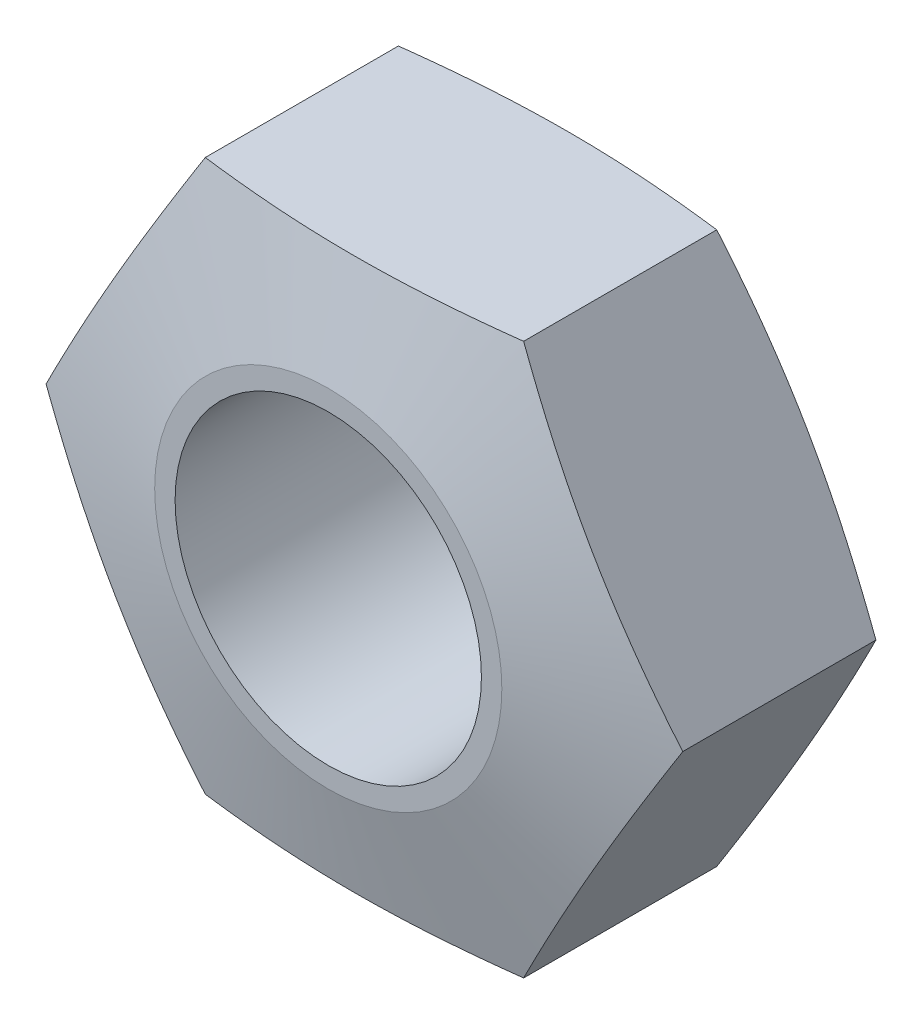
ISO-10303-21;
HEADER;
FILE_DESCRIPTION(('STEP AP214'),'2;1');
FILE_NAME('part.step','',(''),(''),'','','');
FILE_SCHEMA(('AUTOMOTIVE_DESIGN { 1 0 10303 214 1 1 1 1 }'));
ENDSEC;
DATA;
#1=APPLICATION_CONTEXT('core data for automotive mechanical design processes');
#2=APPLICATION_PROTOCOL_DEFINITION('international standard','automotive_design',2000,#1);
#3=PRODUCT_CONTEXT('',#1,'mechanical');
#4=PRODUCT('Part','Part','',(#3));
#5=PRODUCT_RELATED_PRODUCT_CATEGORY('part','',(#4));
#6=PRODUCT_DEFINITION_FORMATION('','',#4);
#7=PRODUCT_DEFINITION_CONTEXT('part definition',#1,'design');
#8=PRODUCT_DEFINITION('design','',#6,#7);
#9=PRODUCT_DEFINITION_SHAPE('','',#8);
#10=(LENGTH_UNIT() NAMED_UNIT(*) SI_UNIT(.MILLI.,.METRE.));
#11=(NAMED_UNIT(*) PLANE_ANGLE_UNIT() SI_UNIT($,.RADIAN.));
#12=(NAMED_UNIT(*) SI_UNIT($,.STERADIAN.) SOLID_ANGLE_UNIT());
#13=UNCERTAINTY_MEASURE_WITH_UNIT(LENGTH_MEASURE(1.E-05),#10,'distance_accuracy_value','');
#14=(GEOMETRIC_REPRESENTATION_CONTEXT(3) GLOBAL_UNCERTAINTY_ASSIGNED_CONTEXT((#13)) GLOBAL_UNIT_ASSIGNED_CONTEXT((#10,
#11,#12)) REPRESENTATION_CONTEXT('',''));
#15=CARTESIAN_POINT('',(0.,0.,0.));
#16=DIRECTION('',(0.,0.,1.));
#17=DIRECTION('',(1.,0.,0.));
#18=AXIS2_PLACEMENT_3D('',#15,#16,#17);
#19=CARTESIAN_POINT('',(-3.11769145362398,0.,2.6));
#20=DIRECTION('',(0.866025403784435,0.500000000000007,0.));
#21=DIRECTION('',(-0.500000000000007,0.866025403784435,0.));
#22=AXIS2_PLACEMENT_3D('',#19,#20,#21);
#23=PLANE('',#22);
#24=DIRECTION('',(0.,0.,1.));
#25=VECTOR('',#24,1.);
#26=CARTESIAN_POINT('',(-1.55884572681197,-2.70000000000002,2.6));
#27=LINE('',#26,#25);
#28=CARTESIAN_POINT('',(-1.55884567831965,-2.70000000000002,0.354422857323158));
#29=VERTEX_POINT('',#28);
#30=CARTESIAN_POINT('',(-1.55884575106109,-2.69999995799929,2.24557714266442));
#31=VERTEX_POINT('',#30);
#32=EDGE_CURVE('E112',#29,#31,#27,.T.);
#33=ORIENTED_EDGE('',*,*,#32,.T.);
#34=CARTESIAN_POINT('',(-3.11769145363667,7.17106538033776E-12,2.24557713660658));
#35=CARTESIAN_POINT('',(-3.05292867419917,-0.112172424408485,2.26177406951914));
#36=CARTESIAN_POINT('',(-2.98806345736563,-0.224522275604257,2.27647355567524));
#37=CARTESIAN_POINT('',(-2.85813356101788,-0.449567457497872,2.30229361562595));
#38=CARTESIAN_POINT('',(-2.79306881954447,-0.56226289551219,2.31341293282755));
#39=CARTESIAN_POINT('',(-2.66308367272997,-0.787403774024961,2.33143583605498));
#40=CARTESIAN_POINT('',(-2.59816393414497,-0.899848059667983,2.33835815564568));
#41=CARTESIAN_POINT('',(-2.46825232603171,-1.12486156541292,2.34763985615969));
#42=CARTESIAN_POINT('',(-2.4032604703706,-1.23743076149622,2.34999999942299));
#43=CARTESIAN_POINT('',(-2.27327675902964,-1.46256915369518,2.3500000006016));
#44=CARTESIAN_POINT('',(-2.20828490334979,-1.57513834981085,2.34763985851636));
#45=CARTESIAN_POINT('',(-2.07837329518059,-1.80015185565285,2.33835816028019));
#46=CARTESIAN_POINT('',(-2.0134535565584,-1.91259614136058,2.33143584178928));
#47=CARTESIAN_POINT('',(-1.88346840965757,-2.13773702002212,2.31341294063358));
#48=CARTESIAN_POINT('',(-1.81840366813497,-2.2504324581206,2.30229362440338));
#49=CARTESIAN_POINT('',(-1.68847377168409,-2.47547764019568,2.27647356624278));
#50=CARTESIAN_POINT('',(-1.62360855479663,-2.58782749148873,2.26177408090534));
#51=CARTESIAN_POINT('',(-1.55884577530877,-2.69999991600109,2.24557714872634));
#52=B_SPLINE_CURVE_WITH_KNOTS('',3,(#34,#35,#36,#37,#38,#39,#40,#41,#42,#43,#44,#45,#46,#47,#48,
#49,#50,#51),.UNSPECIFIED.,.F.,.F.,(4,2,2,2,2,2,2,2,4),(0.,0.391620655021264,0.783378614368188,
1.17337481077486,1.5633058331533,1.95323685557831,2.34323305202915,2.73499101141513,
3.12661166648705),.UNSPECIFIED.);
#53=CARTESIAN_POINT('',(-3.11769145360933,5.10648189547578E-12,2.2455771366119));
#54=VERTEX_POINT('',#53);
#55=EDGE_CURVE('E95',#54,#31,#52,.T.);
#56=ORIENTED_EDGE('',*,*,#55,.F.);
#57=DIRECTION('',(0.,0.,1.));
#58=VECTOR('',#57,1.);
#59=CARTESIAN_POINT('',(-3.11769145362398,0.,2.6));
#60=LINE('',#59,#58);
#61=CARTESIAN_POINT('',(-3.11769145362801,0.,0.354422863381387));
#62=VERTEX_POINT('',#61);
#63=EDGE_CURVE('E42',#54,#62,#60,.F.);
#64=ORIENTED_EDGE('',*,*,#63,.T.);
#65=CARTESIAN_POINT('',(-1.55884570367168,-2.70000004008016,0.354422869169767));
#66=CARTESIAN_POINT('',(-1.6236084860841,-2.58782761050233,0.338225935148355));
#67=CARTESIAN_POINT('',(-1.68847370590511,-2.47547775412822,0.323526447987274));
#68=CARTESIAN_POINT('',(-1.81840360825192,-2.25043256184108,0.297706386316205));
#69=CARTESIAN_POINT('',(-1.88346835273694,-2.13773711861154,0.286587068399497));
#70=CARTESIAN_POINT('',(-2.01345350555274,-1.91259622970499,0.268564164121406));
#71=CARTESIAN_POINT('',(-2.07837324712729,-1.80015193888362,0.261641844191989));
#72=CARTESIAN_POINT('',(-2.20828486122402,-1.57513842277481,0.252360143429213));
#73=CARTESIAN_POINT('',(-2.27327671987903,-1.462569221506,0.25000000025567));
#74=CARTESIAN_POINT('',(-2.40326043719796,-1.23743081895294,0.249999999693409));
#75=CARTESIAN_POINT('',(-2.46825229586189,-1.12486161766869,0.25236014230496));
#76=CARTESIAN_POINT('',(-2.59816390998531,-0.899848101513635,0.261641841981025));
#77=CARTESIAN_POINT('',(-2.66308365157766,-0.787403810661453,0.268564161385716));
#78=CARTESIAN_POINT('',(-2.79306880443445,-0.562262921683897,0.286587064675604));
#79=CARTESIAN_POINT('',(-2.8581335489427,-0.449567478414119,0.297706382129095));
#80=CARTESIAN_POINT('',(-2.9880634513393,-0.224522286040744,0.323526442945617));
#81=CARTESIAN_POINT('',(-3.05292867118686,-0.112172429620652,0.338225929715393));
#82=CARTESIAN_POINT('',(-3.11769145362534,2.33767635153521E-12,0.354422863385037));
#83=B_SPLINE_CURVE_WITH_KNOTS('',3,(#65,#66,#67,#68,#69,#70,#71,#72,#73,#74,#75,#76,#77,#78,#79,
#80,#81,#82),.UNSPECIFIED.,.F.,.F.,(4,2,2,2,2,2,2,2,4),(0.,0.391620673173809,0.783378650698375,
1.1733748650613,1.56330590538311,1.95323694572706,2.34323316011099,2.7349911376541,
3.12661181085199),.UNSPECIFIED.);
#84=EDGE_CURVE('E101',#29,#62,#83,.T.);
#85=ORIENTED_EDGE('',*,*,#84,.F.);
#86=EDGE_LOOP('',(#33,#56,#64,#85));
#87=FACE_BOUND('',#86,.T.);
#88=ADVANCED_FACE('F17',(#87),#23,.F.);
#89=CARTESIAN_POINT('',(-1.55884572681197,-2.70000000000002,2.6));
#90=DIRECTION('',(0.,1.,0.));
#91=DIRECTION('',(-1.,0.,0.));
#92=AXIS2_PLACEMENT_3D('',#89,#90,#91);
#93=PLANE('',#92);
#94=DIRECTION('',(0.,0.,1.));
#95=VECTOR('',#94,1.);
#96=CARTESIAN_POINT('',(1.55884572681202,-2.69999999999998,2.6));
#97=LINE('',#96,#95);
#98=CARTESIAN_POINT('',(1.55884575106576,-2.69999995799128,0.354422857321263));
#99=VERTEX_POINT('',#98);
#100=CARTESIAN_POINT('',(1.55884567829528,-2.69999999999998,2.24557714266673));
#101=VERTEX_POINT('',#100);
#102=EDGE_CURVE('E83',#99,#101,#97,.T.);
#103=ORIENTED_EDGE('',*,*,#102,.T.);
#104=CARTESIAN_POINT('',(-1.55884577310247,-2.70000000000002,2.24557713081583));
#105=CARTESIAN_POINT('',(-1.42932021234828,-2.70000000000002,2.2617740643271));
#106=CARTESIAN_POINT('',(-1.29958977679113,-2.70000000000001,2.27647355107367));
#107=CARTESIAN_POINT('',(-1.03972998029237,-2.70000000000001,2.30229361215921));
#108=CARTESIAN_POINT('',(-0.909600495432358,-2.70000000000001,2.31341292990508));
#109=CARTESIAN_POINT('',(-0.649630197984574,-2.70000000000001,2.33143583414074));
#110=CARTESIAN_POINT('',(-0.519790718909102,-2.70000000000001,2.33835815419625));
#111=CARTESIAN_POINT('',(-0.259967498856544,-2.7,2.34763985552666));
#112=CARTESIAN_POINT('',(-0.129983785613781,-2.7,2.34999999914162));
#113=CARTESIAN_POINT('',(0.12998364092693,-2.7,2.35000000088297));
#114=CARTESIAN_POINT('',(0.259967354224877,-2.7,2.34763985900851));
#115=CARTESIAN_POINT('',(0.519790574442815,-2.69999999999999,2.33835816104368));
#116=CARTESIAN_POINT('',(0.649630053628494,-2.69999999999999,2.33143584261326));
#117=CARTESIAN_POINT('',(0.909600351330207,-2.69999999999999,2.3134129414381));
#118=CARTESIAN_POINT('',(1.0397298363341,-2.69999999999999,2.30229362512683));
#119=CARTESIAN_POINT('',(1.29958963314124,-2.69999999999999,2.27647356668785));
#120=CARTESIAN_POINT('',(1.42932006886286,-2.69999999999998,2.26177408115317));
#121=CARTESIAN_POINT('',(1.55884562977853,-2.69999999999998,2.24557714873132));
#122=B_SPLINE_CURVE_WITH_KNOTS('',3,(#104,#105,#106,#107,#108,#109,#110,#111,#112,#113,#114,
#115,#116,#117,#118,#119,#120,#121),.UNSPECIFIED.,.F.,.F.,(4,2,2,2,2,2,2,2,4),(0.,
0.391620660863815,0.783378626065073,1.1733748282529,1.56330585640758,1.95323688463083,
2.3432330868837,2.73499105214241,3.12661171308077),.UNSPECIFIED.);
#123=EDGE_CURVE('E165',#31,#101,#122,.T.);
#124=ORIENTED_EDGE('',*,*,#123,.F.);
#125=ORIENTED_EDGE('',*,*,#32,.F.);
#126=CARTESIAN_POINT('',(1.55884577307533,-2.69999999999998,0.35442286916761));
#127=CARTESIAN_POINT('',(1.42932021232014,-2.69999999999998,0.338225935656415));
#128=CARTESIAN_POINT('',(1.29958977676198,-2.69999999999999,0.323526448909981));
#129=CARTESIAN_POINT('',(1.03972998026121,-2.69999999999999,0.297706387824801));
#130=CARTESIAN_POINT('',(0.909600495400188,-2.69999999999999,0.286587070079166));
#131=CARTESIAN_POINT('',(0.649630197950403,-2.69999999999999,0.268564165844075));
#132=CARTESIAN_POINT('',(0.519790718873938,-2.69999999999999,0.261641845788902));
#133=CARTESIAN_POINT('',(0.259967498819406,-2.7,0.252360144459265));
#134=CARTESIAN_POINT('',(0.129983785575663,-2.7,0.250000000844739));
#135=CARTESIAN_POINT('',(-0.129983640966979,-2.7,0.249999999104341));
#136=CARTESIAN_POINT('',(-0.259967354265877,-2.7,0.252360140979298));
#137=CARTESIAN_POINT('',(-0.519790574485699,-2.70000000000001,0.261641838945176));
#138=CARTESIAN_POINT('',(-0.649630053672312,-2.70000000000001,0.268564157376136));
#139=CARTESIAN_POINT('',(-0.909600351375887,-2.70000000000001,0.286587058552386));
#140=CARTESIAN_POINT('',(-1.03972983638071,-2.70000000000001,0.297706374864199));
#141=CARTESIAN_POINT('',(-1.2995896331897,-2.70000000000001,0.32352643330425));
#142=CARTESIAN_POINT('',(-1.42932006891224,-2.70000000000002,0.338225918839456));
#143=CARTESIAN_POINT('',(-1.55884562982882,-2.70000000000002,0.354422851261804));
#144=B_SPLINE_CURVE_WITH_KNOTS('',3,(#126,#127,#128,#129,#130,#131,#132,#133,#134,#135,#136,
#137,#138,#139,#140,#141,#142,#143),.UNSPECIFIED.,.F.,.F.,(4,2,2,2,2,2,2,2,4),(0.,
0.391620660866765,0.783378626070974,1.17337482826172,1.56330585641932,1.95323688464545,
2.34323308690119,2.73499105216282,3.1266117131041),.UNSPECIFIED.);
#145=EDGE_CURVE('E100',#99,#29,#144,.T.);
#146=ORIENTED_EDGE('',*,*,#145,.F.);
#147=EDGE_LOOP('',(#103,#124,#125,#146));
#148=FACE_BOUND('',#147,.T.);
#149=ADVANCED_FACE('F171',(#148),#93,.F.);
#150=CARTESIAN_POINT('',(1.55884572681202,-2.69999999999998,2.6));
#151=DIRECTION('',(-0.866025403784442,0.499999999999995,0.));
#152=DIRECTION('',(-0.499999999999995,-0.866025403784442,0.));
#153=AXIS2_PLACEMENT_3D('',#150,#151,#152);
#154=PLANE('',#153);
#155=DIRECTION('',(0.,0.,1.));
#156=VECTOR('',#155,1.);
#157=CARTESIAN_POINT('',(3.11769145362398,0.,2.6));
#158=LINE('',#157,#156);
#159=CARTESIAN_POINT('',(3.11769145357863,-1.17811917772092E-12,0.354422863361634));
#160=VERTEX_POINT('',#159);
#161=CARTESIAN_POINT('',(3.11769145362801,0.,2.24557713660545));
#162=VERTEX_POINT('',#161);
#163=EDGE_CURVE('E71',#160,#162,#158,.T.);
#164=ORIENTED_EDGE('',*,*,#163,.T.);
#165=CARTESIAN_POINT('',(1.55884570367207,-2.70000004007956,2.24557713081715));
#166=CARTESIAN_POINT('',(1.62360848608469,-2.58782761050137,2.26177406483861));
#167=CARTESIAN_POINT('',(1.68847370590591,-2.4754777541269,2.27647355199973));
#168=CARTESIAN_POINT('',(1.81840360825314,-2.25043256183903,2.30229361367084));
#169=CARTESIAN_POINT('',(1.88346835273837,-2.13773711860912,2.31341293158756));
#170=CARTESIAN_POINT('',(2.01345350555457,-1.91259622970184,2.33143583586564));
#171=CARTESIAN_POINT('',(2.07837324712933,-1.80015193888012,2.33835815579504));
#172=CARTESIAN_POINT('',(2.20828486122647,-1.57513842277058,2.34763985655774));
#173=CARTESIAN_POINT('',(2.27327671988169,-1.46256922150141,2.34999999973123));
#174=CARTESIAN_POINT('',(2.40326043720104,-1.23743081894763,2.35000000029335));
#175=CARTESIAN_POINT('',(2.46825229586516,-1.12486161766303,2.34763985768172));
#176=CARTESIAN_POINT('',(2.598163909989,-0.89984810150726,2.33835815800547));
#177=CARTESIAN_POINT('',(2.66308365158155,-0.787403810654722,2.33143583860067));
#178=CARTESIAN_POINT('',(2.79306880443874,-0.562262921676457,2.31341293531055));
#179=CARTESIAN_POINT('',(2.85813354894719,-0.449567478406324,2.30229361785693));
#180=CARTESIAN_POINT('',(2.9880634513442,-0.224522286032242,2.27647355704016));
#181=CARTESIAN_POINT('',(3.05292867119196,-0.112172429611798,2.26177407027025));
#182=CARTESIAN_POINT('',(3.11769145363064,1.15417427871277E-11,2.24557713660047));
#183=B_SPLINE_CURVE_WITH_KNOTS('',3,(#165,#166,#167,#168,#169,#170,#171,#172,#173,#174,#175,
#176,#177,#178,#179,#180,#181,#182),.UNSPECIFIED.,.F.,.F.,(4,2,2,2,2,2,2,2,4),(0.,
0.391620673175067,0.783378650700892,1.17337486506506,1.56330590538811,1.9532369457333,
2.34323316011847,2.73499113766284,3.12661181086197),.UNSPECIFIED.);
#184=EDGE_CURVE('E153',#101,#162,#183,.T.);
#185=ORIENTED_EDGE('',*,*,#184,.F.);
#186=ORIENTED_EDGE('',*,*,#102,.F.);
#187=CARTESIAN_POINT('',(3.11769145362534,2.3560685272518E-12,0.354422863385037));
#188=CARTESIAN_POINT('',(3.05292867419276,-0.11217242441425,0.338225930468905));
#189=CARTESIAN_POINT('',(2.9880634573616,-0.224522275609791,0.323526444311441));
#190=CARTESIAN_POINT('',(2.85813356101638,-0.449567457501875,0.297706384359939));
#191=CARTESIAN_POINT('',(2.79306881954312,-0.562262895514894,0.286587067158907));
#192=CARTESIAN_POINT('',(2.66308367272954,-0.78740377402532,0.268564163931995));
#193=CARTESIAN_POINT('',(2.59816393414531,-0.899848059667296,0.261641844341245));
#194=CARTESIAN_POINT('',(2.46825232603342,-1.12486156541008,0.2523601438272));
#195=CARTESIAN_POINT('',(2.40326047037291,-1.23743076149227,0.250000000563909));
#196=CARTESIAN_POINT('',(2.27327675903321,-1.46256915368898,0.249999999385176));
#197=CARTESIAN_POINT('',(2.20828490335403,-1.57513834980352,0.252360141470295));
#198=CARTESIAN_POINT('',(2.07837329518616,-1.80015185564325,0.261641839706141));
#199=CARTESIAN_POINT('',(2.01345355656463,-1.91259614134984,0.268564158196848));
#200=CARTESIAN_POINT('',(1.8834684096651,-2.13773702000912,0.286587059352073));
#201=CARTESIAN_POINT('',(1.81840366814315,-2.25043245810649,0.297706375582009));
#202=CARTESIAN_POINT('',(1.68847377169355,-2.47547764017935,0.323526433742024));
#203=CARTESIAN_POINT('',(1.62360855480673,-2.58782749147131,0.338225919079149));
#204=CARTESIAN_POINT('',(1.55884577531949,-2.69999991598258,0.354422851257829));
#205=B_SPLINE_CURVE_WITH_KNOTS('',3,(#187,#188,#189,#190,#191,#192,#193,#194,#195,#196,#197,
#198,#199,#200,#201,#202,#203,#204),.UNSPECIFIED.,.F.,.F.,(4,2,2,2,2,2,2,2,4),(0.,
0.391620655017581,0.783378614360735,1.17337481076358,1.56330583313823,1.95323685555929,
2.34323305200616,2.73499101138821,3.12661166645625),.UNSPECIFIED.);
#206=EDGE_CURVE('E21',#160,#99,#205,.T.);
#207=ORIENTED_EDGE('',*,*,#206,.F.);
#208=EDGE_LOOP('',(#164,#185,#186,#207));
#209=FACE_BOUND('',#208,.T.);
#210=ADVANCED_FACE('F98',(#209),#154,.F.);
#211=CARTESIAN_POINT('',(3.11769145362398,0.,2.6));
#212=DIRECTION('',(-0.866025403784438,-0.500000000000001,0.));
#213=DIRECTION('',(0.500000000000001,-0.866025403784438,0.));
#214=AXIS2_PLACEMENT_3D('',#211,#212,#213);
#215=PLANE('',#214);
#216=DIRECTION('',(0.,0.,1.));
#217=VECTOR('',#216,1.);
#218=CARTESIAN_POINT('',(1.55884572681198,2.70000000000001,2.6));
#219=LINE('',#218,#217);
#220=CARTESIAN_POINT('',(1.55884567832044,2.70000000000001,0.354422857323253));
#221=VERTEX_POINT('',#220);
#222=CARTESIAN_POINT('',(1.55884575105879,2.6999999580033,2.24557714266384));
#223=VERTEX_POINT('',#222);
#224=EDGE_CURVE('E82',#221,#223,#219,.T.);
#225=ORIENTED_EDGE('',*,*,#224,.T.);
#226=CARTESIAN_POINT('',(3.11769145363666,-7.18371535401873E-12,2.24557713660659));
#227=CARTESIAN_POINT('',(3.05292867419898,0.112172424408789,2.26177406951918));
#228=CARTESIAN_POINT('',(2.98806345736526,0.224522275604879,2.27647355567533));
#229=CARTESIAN_POINT('',(2.85813356101714,0.449567457499133,2.30229361562609));
#230=CARTESIAN_POINT('',(2.79306881954355,0.562262895513772,2.3134129328277));
#231=CARTESIAN_POINT('',(2.66308367272868,0.78740377402718,2.33143583605513));
#232=CARTESIAN_POINT('',(2.5981639341435,0.89984805967052,2.33835815564583));
#233=CARTESIAN_POINT('',(2.46825232602987,1.12486156541609,2.34763985615978));
#234=CARTESIAN_POINT('',(2.40326047036858,1.23743076149971,2.34999999942304));
#235=CARTESIAN_POINT('',(2.27327675902726,1.4625691536993,2.35000000060155));
#236=CARTESIAN_POINT('',(2.20828490334723,1.57513834981528,2.34763985851624));
#237=CARTESIAN_POINT('',(2.07837329517767,1.80015185565792,2.33835816027991));
#238=CARTESIAN_POINT('',(2.01345355655531,1.91259614136595,2.33143584178892));
#239=CARTESIAN_POINT('',(1.88346840965412,2.13773702002812,2.31341294063303));
#240=CARTESIAN_POINT('',(1.81840366813133,2.25043245812691,2.30229362440272));
#241=CARTESIAN_POINT('',(1.6884737716801,2.47547764020261,2.27647356624191));
#242=CARTESIAN_POINT('',(1.62360855479246,2.58782749149597,2.26177408090436));
#243=CARTESIAN_POINT('',(1.55884577530442,2.69999991600864,2.24557714872525));
#244=B_SPLINE_CURVE_WITH_KNOTS('',3,(#226,#227,#228,#229,#230,#231,#232,#233,#234,#235,#236,
#237,#238,#239,#240,#241,#242,#243),.UNSPECIFIED.,.F.,.F.,(4,2,2,2,2,2,2,2,4),(0.,
0.391620655022372,0.783378614370402,1.17337481077817,1.56330583315771,1.95323685558381,
2.34323305203574,2.73499101142282,3.12661166649584),.UNSPECIFIED.);
#245=EDGE_CURVE('E78',#162,#223,#244,.T.);
#246=ORIENTED_EDGE('',*,*,#245,.F.);
#247=ORIENTED_EDGE('',*,*,#163,.F.);
#248=CARTESIAN_POINT('',(1.55884570367247,2.70000004007882,0.354422869169576));
#249=CARTESIAN_POINT('',(1.62360848608485,2.58782761050104,0.338225935148184));
#250=CARTESIAN_POINT('',(1.68847370590583,2.475477754127,0.323526447987122));
#251=CARTESIAN_POINT('',(1.81840360825258,2.25043256183996,0.29770638631609));
#252=CARTESIAN_POINT('',(1.88346835273757,2.13773711861047,0.286587068399401));
#253=CARTESIAN_POINT('',(2.01345350555329,1.91259622970403,0.268564164121342));
#254=CARTESIAN_POINT('',(2.07837324712781,1.80015193888272,0.261641844191941));
#255=CARTESIAN_POINT('',(2.20828486122448,1.57513842277402,0.252360143429192));
#256=CARTESIAN_POINT('',(2.27327671987946,1.46256922150526,0.250000000255661));
#257=CARTESIAN_POINT('',(2.40326043719833,1.23743081895231,0.249999999693418));
#258=CARTESIAN_POINT('',(2.46825229586221,1.12486161766812,0.252360142304976));
#259=CARTESIAN_POINT('',(2.59816390998558,0.899848101513172,0.26164184198105));
#260=CARTESIAN_POINT('',(2.66308365157789,0.787403810661045,0.268564161385743));
#261=CARTESIAN_POINT('',(2.79306880443461,0.5622629216836,0.28658706467563));
#262=CARTESIAN_POINT('',(2.85813354894283,0.449567478413878,0.297706382129118));
#263=CARTESIAN_POINT('',(2.98806345133936,0.224522286040614,0.323526442945631));
#264=CARTESIAN_POINT('',(3.05292867118689,0.112172429620578,0.338225929715401));
#265=CARTESIAN_POINT('',(3.11769145362534,-2.35620920535988E-12,0.354422863385037));
#266=B_SPLINE_CURVE_WITH_KNOTS('',3,(#248,#249,#250,#251,#252,#253,#254,#255,#256,#257,#258,
#259,#260,#261,#262,#263,#264,#265),.UNSPECIFIED.,.F.,.F.,(4,2,2,2,2,2,2,2,4),(0.,
0.391620673173616,0.783378650697987,1.17337486506072,1.56330590538234,1.95323694572609,
2.34323316010983,2.73499113765275,3.12661181085044),.UNSPECIFIED.);
#267=EDGE_CURVE('E75',#221,#160,#266,.T.);
#268=ORIENTED_EDGE('',*,*,#267,.F.);
#269=EDGE_LOOP('',(#225,#246,#247,#268));
#270=FACE_BOUND('',#269,.T.);
#271=ADVANCED_FACE('F74',(#270),#215,.F.);
#272=CARTESIAN_POINT('',(1.55884572681198,2.70000000000001,2.6));
#273=DIRECTION('',(0.,-1.,0.));
#274=DIRECTION('',(1.,0.,0.));
#275=AXIS2_PLACEMENT_3D('',#272,#273,#274);
#276=PLANE('',#275);
#277=DIRECTION('',(0.,0.,1.));
#278=VECTOR('',#277,1.);
#279=CARTESIAN_POINT('',(-1.558845726812,2.69999999999999,2.6));
#280=LINE('',#279,#278);
#281=CARTESIAN_POINT('',(-1.55884575105721,2.69999995800606,0.354422857323395));
#282=VERTEX_POINT('',#281);
#283=CARTESIAN_POINT('',(-1.55884567829706,2.69999999999999,2.24557714266651));
#284=VERTEX_POINT('',#283);
#285=EDGE_CURVE('E102',#282,#284,#280,.T.);
#286=ORIENTED_EDGE('',*,*,#285,.T.);
#287=CARTESIAN_POINT('',(1.5588457730932,2.70000000000001,2.24557713081699));
#288=CARTESIAN_POINT('',(1.42932021233924,2.70000000000001,2.26177406432817));
#289=CARTESIAN_POINT('',(1.29958977678232,2.70000000000001,2.27647355107463));
#290=CARTESIAN_POINT('',(1.03972998028402,2.7,2.30229361215996));
#291=CARTESIAN_POINT('',(0.90960049542424,2.7,2.31341292990573));
#292=CARTESIAN_POINT('',(0.649630197976919,2.7,2.33143583414119));
#293=CARTESIAN_POINT('',(0.519790718901678,2.7,2.3383581541966));
#294=CARTESIAN_POINT('',(0.259967498849587,2.7,2.34763985552683));
#295=CARTESIAN_POINT('',(0.129983785607059,2.7,2.3499999991417));
#296=CARTESIAN_POINT('',(-0.129983640933177,2.7,2.35000000088289));
#297=CARTESIAN_POINT('',(-0.259967354230884,2.7,2.34763985900837));
#298=CARTESIAN_POINT('',(-0.519790574448341,2.7,2.33835816104342));
#299=CARTESIAN_POINT('',(-0.649630053633778,2.7,2.33143584261295));
#300=CARTESIAN_POINT('',(-0.909600351335005,2.7,2.31341294143771));
#301=CARTESIAN_POINT('',(-1.03972983633866,2.7,2.30229362512642));
#302=CARTESIAN_POINT('',(-1.2995896331453,2.7,2.2764735666874));
#303=CARTESIAN_POINT('',(-1.42932006886668,2.7,2.26177408115272));
#304=CARTESIAN_POINT('',(-1.55884562978211,2.69999999999999,2.24557714873087));
#305=B_SPLINE_CURVE_WITH_KNOTS('',3,(#287,#288,#289,#290,#291,#292,#293,#294,#295,#296,#297,
#298,#299,#300,#301,#302,#303,#304),.UNSPECIFIED.,.F.,.F.,(4,2,2,2,2,2,2,2,4),(0.,
0.391620660863098,0.783378626063637,1.17337482825075,1.56330585640473,1.95323688462727,
2.34323308687941,2.7349910521374,3.12661171307504),.UNSPECIFIED.);
#306=EDGE_CURVE('E131',#223,#284,#305,.T.);
#307=ORIENTED_EDGE('',*,*,#306,.F.);
#308=ORIENTED_EDGE('',*,*,#224,.F.);
#309=CARTESIAN_POINT('',(-1.55884577308877,2.69999999999999,0.354422869169292));
#310=CARTESIAN_POINT('',(-1.42932021233297,2.7,0.338225935657917));
#311=CARTESIAN_POINT('',(-1.29958977677419,2.7,0.323526448911305));
#312=CARTESIAN_POINT('',(-1.03972998027219,2.7,0.297706387825786));
#313=CARTESIAN_POINT('',(-0.909600495410557,2.7,0.286587070079991));
#314=CARTESIAN_POINT('',(-0.64963019795954,2.7,0.268564165844606));
#315=CARTESIAN_POINT('',(-0.519790718882459,2.7,0.2616418457893));
#316=CARTESIAN_POINT('',(-0.259967498826694,2.7,0.252360144459433));
#317=CARTESIAN_POINT('',(-0.129983785582331,2.7,0.250000000844812));
#318=CARTESIAN_POINT('',(0.129983640961554,2.7,0.249999999104268));
#319=CARTESIAN_POINT('',(0.259967354261075,2.7,0.252360140979175));
#320=CARTESIAN_POINT('',(0.519790574482145,2.7,0.261641838945));
#321=CARTESIAN_POINT('',(0.649630053669382,2.7,0.268564157375957));
#322=CARTESIAN_POINT('',(0.909600351374211,2.7,0.286587058552244));
#323=CARTESIAN_POINT('',(1.03972983637967,2.7,0.297706374864097));
#324=CARTESIAN_POINT('',(1.2995896331899,2.70000000000001,0.323526433304265));
#325=CARTESIAN_POINT('',(1.42932006891307,2.70000000000001,0.338225918839547));
#326=CARTESIAN_POINT('',(1.55884562983028,2.70000000000001,0.354422851261984));
#327=B_SPLINE_CURVE_WITH_KNOTS('',3,(#309,#310,#311,#312,#313,#314,#315,#316,#317,#318,#319,
#320,#321,#322,#323,#324,#325,#326),.UNSPECIFIED.,.F.,.F.,(4,2,2,2,2,2,2,2,4),(0.,
0.391620660868648,0.783378626074743,1.17337482826735,1.56330585642681,1.95323688465481,
2.34323308691242,2.73499105217594,3.12661171311911),.UNSPECIFIED.);
#328=EDGE_CURVE('E94',#282,#221,#327,.T.);
#329=ORIENTED_EDGE('',*,*,#328,.F.);
#330=EDGE_LOOP('',(#286,#307,#308,#329));
#331=FACE_BOUND('',#330,.T.);
#332=ADVANCED_FACE('F202',(#331),#276,.F.);
#333=CARTESIAN_POINT('',(-1.558845726812,2.69999999999999,2.6));
#334=DIRECTION('',(0.866025403784441,-0.499999999999995,0.));
#335=DIRECTION('',(0.499999999999995,0.866025403784441,0.));
#336=AXIS2_PLACEMENT_3D('',#333,#334,#335);
#337=PLANE('',#336);
#338=ORIENTED_EDGE('',*,*,#63,.F.);
#339=CARTESIAN_POINT('',(-1.55884570367385,2.70000004007645,2.2455771308176));
#340=CARTESIAN_POINT('',(-1.6236084860864,2.58782761049838,2.26177406483901));
#341=CARTESIAN_POINT('',(-1.68847370590754,2.47547775412405,2.27647355200008));
#342=CARTESIAN_POINT('',(-1.81840360825462,2.25043256183643,2.30229361367111));
#343=CARTESIAN_POINT('',(-1.88346835273978,2.13773711860665,2.31341293158779));
#344=CARTESIAN_POINT('',(-2.01345350555584,1.91259622969963,2.33143583586579));
#345=CARTESIAN_POINT('',(-2.07837324713053,1.80015193887803,2.33835815579515));
#346=CARTESIAN_POINT('',(-2.20828486122752,1.57513842276875,2.34763985655779));
#347=CARTESIAN_POINT('',(-2.27327671988266,1.4625692214997,2.34999999973126));
#348=CARTESIAN_POINT('',(-2.40326043720186,1.23743081894618,2.35000000029334));
#349=CARTESIAN_POINT('',(-2.46825229586591,1.12486161766171,2.34763985768169));
#350=CARTESIAN_POINT('',(-2.5981639099896,0.899848101506204,2.33835815800541));
#351=CARTESIAN_POINT('',(-2.66308365158207,0.787403810653796,2.33143583860061));
#352=CARTESIAN_POINT('',(-2.79306880443911,0.562262921675792,2.31341293531049));
#353=CARTESIAN_POINT('',(-2.85813354894749,0.44956747840579,2.30229361785688));
#354=CARTESIAN_POINT('',(-2.98806345134434,0.224522286031969,2.27647355704012));
#355=CARTESIAN_POINT('',(-3.05292867119203,0.112172429611656,2.26177407027023));
#356=CARTESIAN_POINT('',(-3.11769145363064,-1.15546730800816E-11,2.24557713660047));
#357=B_SPLINE_CURVE_WITH_KNOTS('',3,(#339,#340,#341,#342,#343,#344,#345,#346,#347,#348,#349,
#350,#351,#352,#353,#354,#355,#356),.UNSPECIFIED.,.F.,.F.,(4,2,2,2,2,2,2,2,4),(0.,
0.391620673174616,0.783378650699988,1.17337486506371,1.56330590538632,1.95323694573106,
2.34323316011578,2.73499113765969,3.12661181085837),.UNSPECIFIED.);
#358=EDGE_CURVE('E123',#284,#54,#357,.T.);
#359=ORIENTED_EDGE('',*,*,#358,.F.);
#360=ORIENTED_EDGE('',*,*,#285,.F.);
#361=CARTESIAN_POINT('',(-3.11769145362534,-2.37447009106022E-12,0.354422863385036));
#362=CARTESIAN_POINT('',(-3.05292867419202,0.112172424415518,0.338225930468718));
#363=CARTESIAN_POINT('',(-2.98806345736011,0.22452227561235,0.323526444311103));
#364=CARTESIAN_POINT('',(-2.8581335610134,0.449567457507024,0.297706384359386));
#365=CARTESIAN_POINT('',(-2.79306881953939,0.562262895521341,0.286587067158292));
#366=CARTESIAN_POINT('',(-2.66308367272431,0.787403774034353,0.268564163931365));
#367=CARTESIAN_POINT('',(-2.59816393413934,0.899848059677617,0.26164184434066));
#368=CARTESIAN_POINT('',(-2.46825232602596,1.12486156542298,0.252360143826821));
#369=CARTESIAN_POINT('',(-2.40326047036471,1.23743076150645,0.250000000563691));
#370=CARTESIAN_POINT('',(-2.27327675902354,1.46256915370572,0.249999999385388));
#371=CARTESIAN_POINT('',(-2.20828490334362,1.57513834982153,0.252360141470776));
#372=CARTESIAN_POINT('',(-2.07837329517428,1.8001518556638,0.261641839707246));
#373=CARTESIAN_POINT('',(-2.01345355655202,1.91259614137165,0.268564158198308));
#374=CARTESIAN_POINT('',(-1.88346840965104,2.13773702003347,0.286587059354305));
#375=CARTESIAN_POINT('',(-1.81840366812835,2.2504324581321,0.297706375584657));
#376=CARTESIAN_POINT('',(-1.6884737716773,2.47547764020749,0.323526433745539));
#377=CARTESIAN_POINT('',(-1.62360855478975,2.5878274915007,0.338225919083116));
#378=CARTESIAN_POINT('',(-1.55884577530179,2.69999991601322,0.35442285126225));
#379=B_SPLINE_CURVE_WITH_KNOTS('',3,(#361,#362,#363,#364,#365,#366,#367,#368,#369,#370,#371,
#372,#373,#374,#375,#376,#377,#378),.UNSPECIFIED.,.F.,.F.,(4,2,2,2,2,2,2,2,4),(0.,
0.391620655022073,0.783378614369724,1.17337481077701,1.5633058331561,1.95323685558159,
2.34323305203288,2.73499101141941,3.12661166649193),.UNSPECIFIED.);
#380=EDGE_CURVE('E188',#62,#282,#379,.T.);
#381=ORIENTED_EDGE('',*,*,#380,.F.);
#382=EDGE_LOOP('',(#338,#359,#360,#381));
#383=FACE_BOUND('',#382,.T.);
#384=ADVANCED_FACE('F138',(#383),#337,.F.);
#385=CARTESIAN_POINT('',(0.,0.,0.356549400578388));
#386=DIRECTION('',(0.,0.,1.));
#387=DIRECTION('',(1.,0.,0.));
#388=AXIS2_PLACEMENT_3D('',#385,#386,#387);
#389=CONICAL_SURFACE('',#388,3.12619760239841,1.32581766365865);
#390=ORIENTED_EDGE('',*,*,#84,.T.);
#391=ORIENTED_EDGE('',*,*,#380,.T.);
#392=ORIENTED_EDGE('',*,*,#328,.T.);
#393=ORIENTED_EDGE('',*,*,#267,.T.);
#394=ORIENTED_EDGE('',*,*,#206,.T.);
#395=ORIENTED_EDGE('',*,*,#145,.T.);
#396=EDGE_LOOP('',(#390,#391,#392,#393,#394,#395));
#397=FACE_BOUND('',#396,.T.);
#398=CARTESIAN_POINT('',(0.,0.,-5.68433646506994E-11));
#399=DIRECTION('',(0.,0.,1.));
#400=DIRECTION('',(1.,0.,0.));
#401=AXIS2_PLACEMENT_3D('',#398,#399,#400);
#402=CIRCLE('',#401,1.69999999991433);
#403=CARTESIAN_POINT('',(1.69999999991433,0.,-5.68433646506994E-11));
#404=VERTEX_POINT('',#403);
#405=EDGE_CURVE('E120',#404,#404,#402,.T.);
#406=ORIENTED_EDGE('',*,*,#405,.T.);
#407=EDGE_LOOP('',(#406));
#408=FACE_BOUND('',#407,.T.);
#409=ADVANCED_FACE('F88',(#397,#408),#389,.T.);
#410=CARTESIAN_POINT('',(0.,0.,2.24345059940845));
#411=DIRECTION('',(0.,0.,-1.));
#412=DIRECTION('',(-1.,0.,0.));
#413=AXIS2_PLACEMENT_3D('',#410,#411,#412);
#414=CONICAL_SURFACE('',#413,3.12619760239841,1.32581766365865);
#415=ORIENTED_EDGE('',*,*,#184,.T.);
#416=ORIENTED_EDGE('',*,*,#245,.T.);
#417=ORIENTED_EDGE('',*,*,#306,.T.);
#418=ORIENTED_EDGE('',*,*,#358,.T.);
#419=ORIENTED_EDGE('',*,*,#55,.T.);
#420=ORIENTED_EDGE('',*,*,#123,.T.);
#421=EDGE_LOOP('',(#415,#416,#417,#418,#419,#420));
#422=FACE_BOUND('',#421,.T.);
#423=CARTESIAN_POINT('',(0.,0.,2.60000000004368));
#424=DIRECTION('',(0.,0.,-1.));
#425=DIRECTION('',(-1.,0.,0.));
#426=AXIS2_PLACEMENT_3D('',#423,#424,#425);
#427=CIRCLE('',#426,1.69999999991433);
#428=CARTESIAN_POINT('',(-1.69999999991433,0.,2.60000000004368));
#429=VERTEX_POINT('',#428);
#430=EDGE_CURVE('E117',#429,#429,#427,.F.);
#431=ORIENTED_EDGE('',*,*,#430,.F.);
#432=EDGE_LOOP('',(#431));
#433=FACE_BOUND('',#432,.T.);
#434=ADVANCED_FACE('F140',(#422,#433),#414,.T.);
#435=CARTESIAN_POINT('',(0.,0.,0.));
#436=DIRECTION('',(0.,0.,1.));
#437=DIRECTION('',(1.,0.,0.));
#438=AXIS2_PLACEMENT_3D('',#435,#436,#437);
#439=PLANE('',#438);
#440=ORIENTED_EDGE('',*,*,#405,.F.);
#441=EDGE_LOOP('',(#440));
#442=FACE_BOUND('',#441,.T.);
#443=CARTESIAN_POINT('',(0.,0.,0.));
#444=DIRECTION('',(0.,0.,-1.));
#445=DIRECTION('',(-1.,0.,0.));
#446=AXIS2_PLACEMENT_3D('',#443,#444,#445);
#447=CIRCLE('',#446,1.5);
#448=CARTESIAN_POINT('',(-1.5,0.,0.));
#449=VERTEX_POINT('',#448);
#450=EDGE_CURVE('E33',#449,#449,#447,.F.);
#451=ORIENTED_EDGE('',*,*,#450,.T.);
#452=EDGE_LOOP('',(#451));
#453=FACE_BOUND('',#452,.T.);
#454=ADVANCED_FACE('F144',(#442,#453),#439,.F.);
#455=CARTESIAN_POINT('',(0.,0.,2.6));
#456=DIRECTION('',(0.,0.,1.));
#457=DIRECTION('',(1.,0.,0.));
#458=AXIS2_PLACEMENT_3D('',#455,#456,#457);
#459=PLANE('',#458);
#460=ORIENTED_EDGE('',*,*,#430,.T.);
#461=EDGE_LOOP('',(#460));
#462=FACE_BOUND('',#461,.T.);
#463=CARTESIAN_POINT('',(0.,0.,2.6));
#464=DIRECTION('',(0.,0.,-1.));
#465=DIRECTION('',(-1.,0.,0.));
#466=AXIS2_PLACEMENT_3D('',#463,#464,#465);
#467=CIRCLE('',#466,1.5);
#468=CARTESIAN_POINT('',(-1.5,0.,2.6));
#469=VERTEX_POINT('',#468);
#470=EDGE_CURVE('E11',#469,#469,#467,.T.);
#471=ORIENTED_EDGE('',*,*,#470,.T.);
#472=EDGE_LOOP('',(#471));
#473=FACE_BOUND('',#472,.T.);
#474=ADVANCED_FACE('F224',(#462,#473),#459,.T.);
#475=CARTESIAN_POINT('',(0.,0.,2.6));
#476=DIRECTION('',(0.,0.,-1.));
#477=DIRECTION('',(-1.,0.,0.));
#478=AXIS2_PLACEMENT_3D('',#475,#476,#477);
#479=CYLINDRICAL_SURFACE('',#478,1.5);
#480=ORIENTED_EDGE('',*,*,#450,.F.);
#481=EDGE_LOOP('',(#480));
#482=FACE_BOUND('',#481,.T.);
#483=ORIENTED_EDGE('',*,*,#470,.F.);
#484=EDGE_LOOP('',(#483));
#485=FACE_BOUND('',#484,.T.);
#486=ADVANCED_FACE('F222',(#482,#485),#479,.F.);
#487=CLOSED_SHELL('',(#88,#149,#210,#271,#332,#384,#409,#434,#454,#474,#486));
#488=MANIFOLD_SOLID_BREP('B1',#487);
#489=ADVANCED_BREP_SHAPE_REPRESENTATION('',(#18,#488),#14);
#490=SHAPE_DEFINITION_REPRESENTATION(#9,#489);
ENDSEC;
END-ISO-10303-21;
